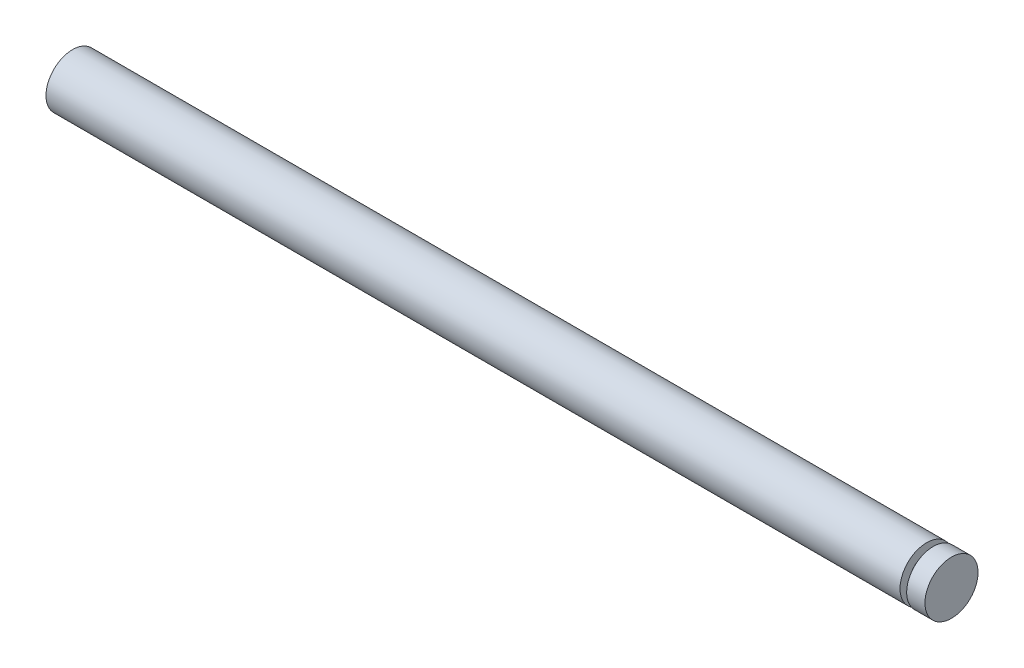
ISO-10303-21;
HEADER;
FILE_DESCRIPTION(('STEP AP214'),'2;1');
FILE_NAME('part.step','',(''),(''),'','','');
FILE_SCHEMA(('AUTOMOTIVE_DESIGN { 1 0 10303 214 1 1 1 1 }'));
ENDSEC;
DATA;
#1=APPLICATION_CONTEXT('core data for automotive mechanical design processes');
#2=APPLICATION_PROTOCOL_DEFINITION('international standard','automotive_design',2000,#1);
#3=PRODUCT_CONTEXT('',#1,'mechanical');
#4=PRODUCT('Part','Part','',(#3));
#5=PRODUCT_RELATED_PRODUCT_CATEGORY('part','',(#4));
#6=PRODUCT_DEFINITION_FORMATION('','',#4);
#7=PRODUCT_DEFINITION_CONTEXT('part definition',#1,'design');
#8=PRODUCT_DEFINITION('design','',#6,#7);
#9=PRODUCT_DEFINITION_SHAPE('','',#8);
#10=(LENGTH_UNIT() NAMED_UNIT(*) SI_UNIT(.MILLI.,.METRE.));
#11=(NAMED_UNIT(*) PLANE_ANGLE_UNIT() SI_UNIT($,.RADIAN.));
#12=(NAMED_UNIT(*) SI_UNIT($,.STERADIAN.) SOLID_ANGLE_UNIT());
#13=UNCERTAINTY_MEASURE_WITH_UNIT(LENGTH_MEASURE(1.E-05),#10,'distance_accuracy_value','');
#14=(GEOMETRIC_REPRESENTATION_CONTEXT(3) GLOBAL_UNCERTAINTY_ASSIGNED_CONTEXT((#13)) GLOBAL_UNIT_ASSIGNED_CONTEXT((#10,
#11,#12)) REPRESENTATION_CONTEXT('',''));
#15=CARTESIAN_POINT('',(0.,0.,0.));
#16=DIRECTION('',(0.,0.,1.));
#17=DIRECTION('',(1.,0.,0.));
#18=AXIS2_PLACEMENT_3D('',#15,#16,#17);
#19=CARTESIAN_POINT('',(609.6,0.,0.));
#20=DIRECTION('',(-1.,0.,0.));
#21=DIRECTION('',(0.,0.,1.));
#22=AXIS2_PLACEMENT_3D('',#19,#20,#21);
#23=CYLINDRICAL_SURFACE('',#22,18.415);
#24=CARTESIAN_POINT('',(592.328,0.,0.));
#25=DIRECTION('',(1.,0.,0.));
#26=DIRECTION('',(0.,0.,-1.));
#27=AXIS2_PLACEMENT_3D('',#24,#25,#26);
#28=CIRCLE('',#27,18.415);
#29=CARTESIAN_POINT('',(592.328,0.,18.415));
#30=VERTEX_POINT('',#29);
#31=EDGE_CURVE('E55',#30,#30,#28,.T.);
#32=CARTESIAN_POINT('',(0.,0.,0.));
#33=DIRECTION('',(1.,0.,0.));
#34=DIRECTION('',(0.,0.,-1.));
#35=AXIS2_PLACEMENT_3D('',#32,#33,#34);
#36=CIRCLE('',#35,18.415);
#37=CARTESIAN_POINT('',(0.,0.,18.415));
#38=VERTEX_POINT('',#37);
#39=EDGE_CURVE('E38',#38,#38,#36,.T.);
#40=CARTESIAN_POINT('',(592.328,0.,18.415));
#41=CARTESIAN_POINT('',(586.157916666667,0.,18.415));
#42=CARTESIAN_POINT('',(579.987833333333,0.,18.415));
#43=CARTESIAN_POINT('',(567.647666666667,0.,18.415));
#44=CARTESIAN_POINT('',(561.477583333333,0.,18.415));
#45=CARTESIAN_POINT('',(549.137416666667,0.,18.415));
#46=CARTESIAN_POINT('',(542.967333333333,0.,18.415));
#47=CARTESIAN_POINT('',(530.627166666667,0.,18.415));
#48=CARTESIAN_POINT('',(524.457083333333,0.,18.415));
#49=CARTESIAN_POINT('',(512.116916666667,0.,18.415));
#50=CARTESIAN_POINT('',(505.946833333333,0.,18.415));
#51=CARTESIAN_POINT('',(493.606666666667,0.,18.415));
#52=CARTESIAN_POINT('',(487.436583333333,0.,18.415));
#53=CARTESIAN_POINT('',(475.096416666667,0.,18.415));
#54=CARTESIAN_POINT('',(468.926333333333,0.,18.415));
#55=CARTESIAN_POINT('',(456.586166666667,0.,18.415));
#56=CARTESIAN_POINT('',(450.416083333333,0.,18.415));
#57=CARTESIAN_POINT('',(438.075916666667,0.,18.415));
#58=CARTESIAN_POINT('',(431.905833333333,0.,18.415));
#59=CARTESIAN_POINT('',(419.565666666667,0.,18.415));
#60=CARTESIAN_POINT('',(413.395583333333,0.,18.415));
#61=CARTESIAN_POINT('',(401.055416666667,0.,18.415));
#62=CARTESIAN_POINT('',(394.885333333333,0.,18.415));
#63=CARTESIAN_POINT('',(382.545166666667,0.,18.415));
#64=CARTESIAN_POINT('',(376.375083333333,0.,18.415));
#65=CARTESIAN_POINT('',(364.034916666667,0.,18.415));
#66=CARTESIAN_POINT('',(357.864833333333,0.,18.415));
#67=CARTESIAN_POINT('',(345.524666666667,0.,18.415));
#68=CARTESIAN_POINT('',(339.354583333333,0.,18.415));
#69=CARTESIAN_POINT('',(327.014416666667,0.,18.415));
#70=CARTESIAN_POINT('',(320.844333333333,0.,18.415));
#71=CARTESIAN_POINT('',(308.504166666667,0.,18.415));
#72=CARTESIAN_POINT('',(302.334083333333,0.,18.415));
#73=CARTESIAN_POINT('',(289.993916666667,0.,18.415));
#74=CARTESIAN_POINT('',(283.823833333333,0.,18.415));
#75=CARTESIAN_POINT('',(271.483666666667,0.,18.415));
#76=CARTESIAN_POINT('',(265.313583333333,0.,18.415));
#77=CARTESIAN_POINT('',(252.973416666667,0.,18.415));
#78=CARTESIAN_POINT('',(246.803333333333,0.,18.415));
#79=CARTESIAN_POINT('',(234.463166666667,0.,18.415));
#80=CARTESIAN_POINT('',(228.293083333333,0.,18.415));
#81=CARTESIAN_POINT('',(215.952916666667,0.,18.415));
#82=CARTESIAN_POINT('',(209.782833333333,0.,18.415));
#83=CARTESIAN_POINT('',(197.442666666667,0.,18.415));
#84=CARTESIAN_POINT('',(191.272583333333,0.,18.415));
#85=CARTESIAN_POINT('',(178.932416666667,0.,18.415));
#86=CARTESIAN_POINT('',(172.762333333333,0.,18.415));
#87=CARTESIAN_POINT('',(160.422166666667,0.,18.415));
#88=CARTESIAN_POINT('',(154.252083333333,0.,18.415));
#89=CARTESIAN_POINT('',(141.911916666667,0.,18.415));
#90=CARTESIAN_POINT('',(135.741833333333,0.,18.415));
#91=CARTESIAN_POINT('',(123.401666666667,0.,18.415));
#92=CARTESIAN_POINT('',(117.231583333333,0.,18.415));
#93=CARTESIAN_POINT('',(104.891416666667,0.,18.415));
#94=CARTESIAN_POINT('',(98.7213333333333,0.,18.415));
#95=CARTESIAN_POINT('',(86.3811666666667,0.,18.415));
#96=CARTESIAN_POINT('',(80.2110833333333,0.,18.415));
#97=CARTESIAN_POINT('',(67.8709166666667,0.,18.415));
#98=CARTESIAN_POINT('',(61.7008333333333,0.,18.415));
#99=CARTESIAN_POINT('',(49.3606666666666,0.,18.415));
#100=CARTESIAN_POINT('',(43.1905833333333,0.,18.415));
#101=CARTESIAN_POINT('',(30.8504166666667,0.,18.415));
#102=CARTESIAN_POINT('',(24.6803333333333,0.,18.415));
#103=CARTESIAN_POINT('',(12.3401666666666,0.,18.415));
#104=CARTESIAN_POINT('',(6.17008333333332,0.,18.415));
#105=CARTESIAN_POINT('',(0.,0.,18.415));
#106=B_SPLINE_CURVE_WITH_KNOTS('',3,(#40,#41,#42,#43,#44,#45,#46,#47,#48,#49,#50,#51,#52,#53,
#54,#55,#56,#57,#58,#59,#60,#61,#62,#63,#64,#65,#66,#67,#68,#69,#70,#71,#72,#73,#74,#75,#76,#77,
#78,#79,#80,#81,#82,#83,#84,#85,#86,#87,#88,#89,#90,#91,#92,#93,#94,#95,#96,#97,#98,#99,#100,
#101,#102,#103,#104,#105),.UNSPECIFIED.,.F.,.F.,(4,2,2,2,2,2,2,2,2,2,2,2,2,2,2,2,2,2,2,2,2,2,2,
2,2,2,2,2,2,2,2,2,4),(0.,18.5102499999999,37.0204999999999,55.53075,74.0409999999999,
92.5512499999999,111.0615,129.57175,148.082,166.59225,185.1025,203.61275,222.123,240.63325,
259.1435,277.65375,296.164,314.67425,333.1845,351.69475,370.205,388.71525,407.2255,425.73575,
444.246,462.75625,481.2665,499.77675,518.287,536.79725,555.3075,573.81775,592.328),.UNSPECIFIED.);
#107=EDGE_CURVE('BSEAM34',#30,#38,#106,.T.);
#108=ORIENTED_EDGE('',*,*,#31,.F.);
#109=ORIENTED_EDGE('',*,*,#39,.T.);
#110=ORIENTED_EDGE('',*,*,#107,.T.);
#111=ORIENTED_EDGE('',*,*,#107,.F.);
#112=EDGE_LOOP('',(#108,#110,#109,#111));
#113=FACE_BOUND('',#112,.T.);
#114=ADVANCED_FACE('F34',(#113),#23,.T.);
#115=CARTESIAN_POINT('',(0.,0.,0.));
#116=DIRECTION('',(1.,0.,0.));
#117=DIRECTION('',(0.,0.,-1.));
#118=AXIS2_PLACEMENT_3D('',#115,#116,#117);
#119=PLANE('',#118);
#120=ORIENTED_EDGE('',*,*,#39,.F.);
#121=EDGE_LOOP('',(#120));
#122=FACE_BOUND('',#121,.T.);
#123=ADVANCED_FACE('F63',(#122),#119,.F.);
#124=CARTESIAN_POINT('',(592.328,18.415,0.));
#125=DIRECTION('',(-1.,0.,0.));
#126=DIRECTION('',(0.,0.,1.));
#127=AXIS2_PLACEMENT_3D('',#124,#125,#126);
#128=PLANE('',#127);
#129=CARTESIAN_POINT('',(592.328,0.,0.));
#130=DIRECTION('',(1.,0.,0.));
#131=DIRECTION('',(0.,0.,-1.));
#132=AXIS2_PLACEMENT_3D('',#129,#130,#131);
#133=CIRCLE('',#132,12.065);
#134=CARTESIAN_POINT('',(592.328,0.,-12.065));
#135=VERTEX_POINT('',#134);
#136=EDGE_CURVE('E45',#135,#135,#133,.T.);
#137=ORIENTED_EDGE('',*,*,#136,.F.);
#138=EDGE_LOOP('',(#137));
#139=FACE_BOUND('',#138,.T.);
#140=ORIENTED_EDGE('',*,*,#31,.T.);
#141=EDGE_LOOP('',(#140));
#142=FACE_BOUND('',#141,.T.);
#143=ADVANCED_FACE('F59',(#139,#142),#128,.F.);
#144=CARTESIAN_POINT('',(611.915821956383,0.,0.));
#145=DIRECTION('',(1.,0.,0.));
#146=DIRECTION('',(0.,0.,-1.));
#147=AXIS2_PLACEMENT_3D('',#144,#145,#146);
#148=CYLINDRICAL_SURFACE('',#147,12.065);
#149=CARTESIAN_POINT('',(596.9,0.,0.));
#150=DIRECTION('',(1.,0.,0.));
#151=DIRECTION('',(0.,0.,-1.));
#152=AXIS2_PLACEMENT_3D('',#149,#150,#151);
#153=CIRCLE('',#152,12.065);
#154=CARTESIAN_POINT('',(596.9,0.,-12.065));
#155=VERTEX_POINT('',#154);
#156=EDGE_CURVE('E49',#155,#155,#153,.T.);
#157=ORIENTED_EDGE('',*,*,#156,.F.);
#158=EDGE_LOOP('',(#157));
#159=FACE_BOUND('',#158,.T.);
#160=ORIENTED_EDGE('',*,*,#136,.T.);
#161=EDGE_LOOP('',(#160));
#162=FACE_BOUND('',#161,.T.);
#163=ADVANCED_FACE('F70',(#159,#162),#148,.T.);
#164=CARTESIAN_POINT('',(596.9,18.415,0.));
#165=DIRECTION('',(1.,0.,0.));
#166=DIRECTION('',(0.,0.,-1.));
#167=AXIS2_PLACEMENT_3D('',#164,#165,#166);
#168=PLANE('',#167);
#169=CARTESIAN_POINT('',(596.9,0.,0.));
#170=DIRECTION('',(1.,0.,0.));
#171=DIRECTION('',(0.,0.,-1.));
#172=AXIS2_PLACEMENT_3D('',#169,#170,#171);
#173=CIRCLE('',#172,18.415);
#174=CARTESIAN_POINT('',(596.9,0.,18.415));
#175=VERTEX_POINT('',#174);
#176=EDGE_CURVE('E52',#175,#175,#173,.T.);
#177=ORIENTED_EDGE('',*,*,#176,.F.);
#178=EDGE_LOOP('',(#177));
#179=FACE_BOUND('',#178,.T.);
#180=ORIENTED_EDGE('',*,*,#156,.T.);
#181=EDGE_LOOP('',(#180));
#182=FACE_BOUND('',#181,.T.);
#183=ADVANCED_FACE('F76',(#179,#182),#168,.F.);
#184=CARTESIAN_POINT('',(609.6,0.,0.));
#185=DIRECTION('',(1.,0.,0.));
#186=DIRECTION('',(0.,0.,-1.));
#187=AXIS2_PLACEMENT_3D('',#184,#185,#186);
#188=PLANE('',#187);
#189=CARTESIAN_POINT('',(609.6,0.,0.));
#190=DIRECTION('',(1.,0.,0.));
#191=DIRECTION('',(0.,0.,-1.));
#192=AXIS2_PLACEMENT_3D('',#189,#190,#191);
#193=CIRCLE('',#192,18.415);
#194=CARTESIAN_POINT('',(609.6,0.,18.415));
#195=VERTEX_POINT('',#194);
#196=EDGE_CURVE('E10',#195,#195,#193,.T.);
#197=ORIENTED_EDGE('',*,*,#196,.T.);
#198=EDGE_LOOP('',(#197));
#199=FACE_BOUND('',#198,.T.);
#200=ADVANCED_FACE('F74',(#199),#188,.T.);
#201=CARTESIAN_POINT('',(596.9,0.,18.415));
#202=CARTESIAN_POINT('',(597.032291666667,0.,18.415));
#203=CARTESIAN_POINT('',(597.164583333333,0.,18.415));
#204=CARTESIAN_POINT('',(597.429166666667,0.,18.415));
#205=CARTESIAN_POINT('',(597.561458333333,0.,18.415));
#206=CARTESIAN_POINT('',(597.826041666667,0.,18.415));
#207=CARTESIAN_POINT('',(597.958333333333,0.,18.415));
#208=CARTESIAN_POINT('',(598.222916666667,0.,18.415));
#209=CARTESIAN_POINT('',(598.355208333333,0.,18.415));
#210=CARTESIAN_POINT('',(598.619791666667,0.,18.415));
#211=CARTESIAN_POINT('',(598.752083333333,0.,18.415));
#212=CARTESIAN_POINT('',(599.016666666667,0.,18.415));
#213=CARTESIAN_POINT('',(599.148958333333,0.,18.415));
#214=CARTESIAN_POINT('',(599.413541666667,0.,18.415));
#215=CARTESIAN_POINT('',(599.545833333333,0.,18.415));
#216=CARTESIAN_POINT('',(599.810416666667,0.,18.415));
#217=CARTESIAN_POINT('',(599.942708333333,0.,18.415));
#218=CARTESIAN_POINT('',(600.207291666667,0.,18.415));
#219=CARTESIAN_POINT('',(600.339583333333,0.,18.415));
#220=CARTESIAN_POINT('',(600.604166666667,0.,18.415));
#221=CARTESIAN_POINT('',(600.736458333333,0.,18.415));
#222=CARTESIAN_POINT('',(601.001041666667,0.,18.415));
#223=CARTESIAN_POINT('',(601.133333333333,0.,18.415));
#224=CARTESIAN_POINT('',(601.397916666667,0.,18.415));
#225=CARTESIAN_POINT('',(601.530208333333,0.,18.415));
#226=CARTESIAN_POINT('',(601.794791666667,0.,18.415));
#227=CARTESIAN_POINT('',(601.927083333333,0.,18.415));
#228=CARTESIAN_POINT('',(602.191666666667,0.,18.415));
#229=CARTESIAN_POINT('',(602.323958333333,0.,18.415));
#230=CARTESIAN_POINT('',(602.588541666667,0.,18.415));
#231=CARTESIAN_POINT('',(602.720833333333,0.,18.415));
#232=CARTESIAN_POINT('',(602.985416666667,0.,18.415));
#233=CARTESIAN_POINT('',(603.117708333333,0.,18.415));
#234=CARTESIAN_POINT('',(603.382291666667,0.,18.415));
#235=CARTESIAN_POINT('',(603.514583333333,0.,18.415));
#236=CARTESIAN_POINT('',(603.779166666667,0.,18.415));
#237=CARTESIAN_POINT('',(603.911458333333,0.,18.415));
#238=CARTESIAN_POINT('',(604.176041666667,0.,18.415));
#239=CARTESIAN_POINT('',(604.308333333333,0.,18.415));
#240=CARTESIAN_POINT('',(604.572916666667,0.,18.415));
#241=CARTESIAN_POINT('',(604.705208333333,0.,18.415));
#242=CARTESIAN_POINT('',(604.969791666667,0.,18.415));
#243=CARTESIAN_POINT('',(605.102083333333,0.,18.415));
#244=CARTESIAN_POINT('',(605.366666666667,0.,18.415));
#245=CARTESIAN_POINT('',(605.498958333333,0.,18.415));
#246=CARTESIAN_POINT('',(605.763541666667,0.,18.415));
#247=CARTESIAN_POINT('',(605.895833333333,0.,18.415));
#248=CARTESIAN_POINT('',(606.160416666667,0.,18.415));
#249=CARTESIAN_POINT('',(606.292708333333,0.,18.415));
#250=CARTESIAN_POINT('',(606.557291666667,0.,18.415));
#251=CARTESIAN_POINT('',(606.689583333333,0.,18.415));
#252=CARTESIAN_POINT('',(606.954166666667,0.,18.415));
#253=CARTESIAN_POINT('',(607.086458333333,0.,18.415));
#254=CARTESIAN_POINT('',(607.351041666667,0.,18.415));
#255=CARTESIAN_POINT('',(607.483333333333,0.,18.415));
#256=CARTESIAN_POINT('',(607.747916666667,0.,18.415));
#257=CARTESIAN_POINT('',(607.880208333333,0.,18.415));
#258=CARTESIAN_POINT('',(608.144791666667,0.,18.415));
#259=CARTESIAN_POINT('',(608.277083333333,0.,18.415));
#260=CARTESIAN_POINT('',(608.541666666667,0.,18.415));
#261=CARTESIAN_POINT('',(608.673958333333,0.,18.415));
#262=CARTESIAN_POINT('',(608.938541666667,0.,18.415));
#263=CARTESIAN_POINT('',(609.070833333333,0.,18.415));
#264=CARTESIAN_POINT('',(609.335416666667,0.,18.415));
#265=CARTESIAN_POINT('',(609.467708333333,0.,18.415));
#266=CARTESIAN_POINT('',(609.6,0.,18.415));
#267=B_SPLINE_CURVE_WITH_KNOTS('',3,(#201,#202,#203,#204,#205,#206,#207,#208,#209,#210,#211,
#212,#213,#214,#215,#216,#217,#218,#219,#220,#221,#222,#223,#224,#225,#226,#227,#228,#229,#230,
#231,#232,#233,#234,#235,#236,#237,#238,#239,#240,#241,#242,#243,#244,#245,#246,#247,#248,#249,
#250,#251,#252,#253,#254,#255,#256,#257,#258,#259,#260,#261,#262,#263,#264,#265,#266),
.UNSPECIFIED.,.F.,.F.,(4,2,2,2,2,2,2,2,2,2,2,2,2,2,2,2,2,2,2,2,2,2,2,2,2,2,2,2,2,2,2,2,4),(0.,
0.396875000000074,0.793750000000037,1.19062500000011,1.58750000000007,1.98437500000004,
2.38125000000011,2.77812500000008,3.17500000000004,3.57187500000011,3.96875000000008,
4.36562500000004,4.76250000000011,5.15937500000008,5.55625000000004,5.95312500000011,
6.35000000000008,6.74687500000004,7.14375000000012,7.54062500000008,7.93750000000004,
8.33437500000012,8.73125000000008,9.12812500000004,9.52500000000012,9.92187500000008,10.31875,
10.7156250000001,11.1125000000001,11.509375,11.9062500000001,12.3031250000001,12.7000000000002),.UNSPECIFIED.);
#268=EDGE_CURVE('BSEAM36',#175,#195,#267,.T.);
#269=ORIENTED_EDGE('',*,*,#176,.T.);
#270=ORIENTED_EDGE('',*,*,#196,.F.);
#271=ORIENTED_EDGE('',*,*,#268,.T.);
#272=ORIENTED_EDGE('',*,*,#268,.F.);
#273=EDGE_LOOP('',(#269,#271,#270,#272));
#274=FACE_BOUND('',#273,.T.);
#275=ADVANCED_FACE('F36',(#274),#23,.T.);
#276=CLOSED_SHELL('',(#114,#123,#143,#163,#183,#200,#275));
#277=MANIFOLD_SOLID_BREP('B2',#276);
#278=ADVANCED_BREP_SHAPE_REPRESENTATION('',(#18,#277),#14);
#279=SHAPE_DEFINITION_REPRESENTATION(#9,#278);
ENDSEC;
END-ISO-10303-21;
